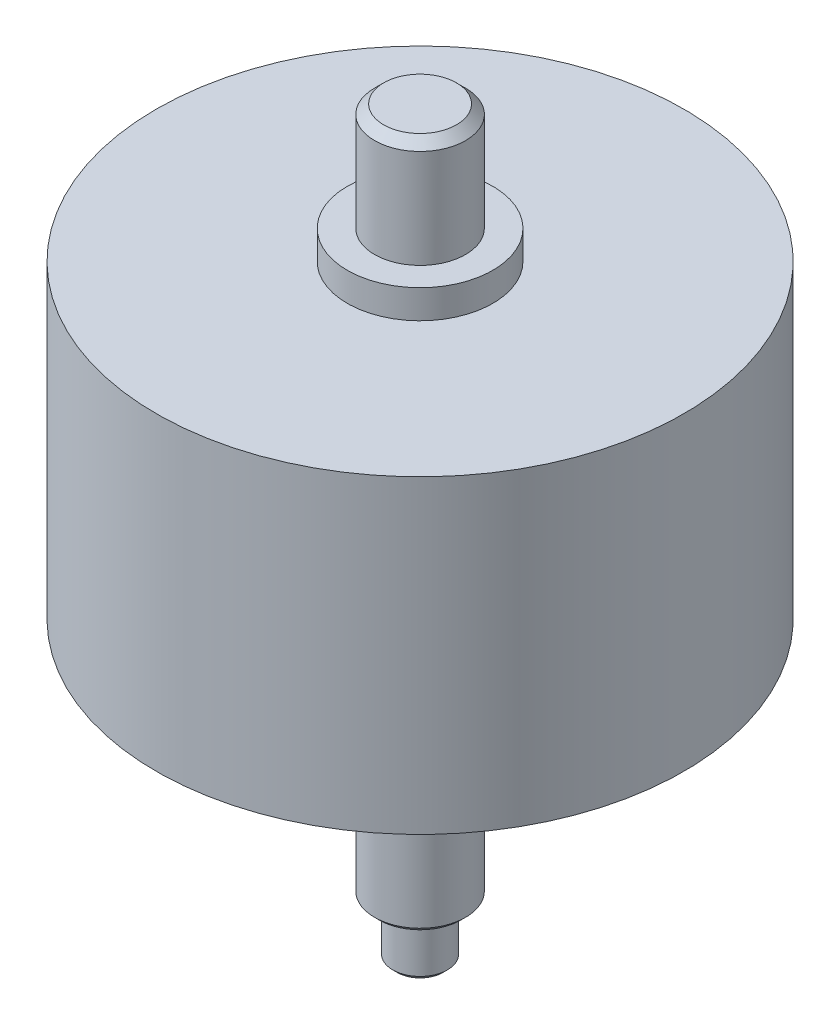
ISO-10303-21;
HEADER;
FILE_DESCRIPTION(('STEP AP214'),'2;1');
FILE_NAME('part.step','',(''),(''),'','','');
FILE_SCHEMA(('AUTOMOTIVE_DESIGN { 1 0 10303 214 1 1 1 1 }'));
ENDSEC;
DATA;
#1=APPLICATION_CONTEXT('core data for automotive mechanical design processes');
#2=APPLICATION_PROTOCOL_DEFINITION('international standard','automotive_design',2000,#1);
#3=PRODUCT_CONTEXT('',#1,'mechanical');
#4=PRODUCT('Part','Part','',(#3));
#5=PRODUCT_RELATED_PRODUCT_CATEGORY('part','',(#4));
#6=PRODUCT_DEFINITION_FORMATION('','',#4);
#7=PRODUCT_DEFINITION_CONTEXT('part definition',#1,'design');
#8=PRODUCT_DEFINITION('design','',#6,#7);
#9=PRODUCT_DEFINITION_SHAPE('','',#8);
#10=(LENGTH_UNIT() NAMED_UNIT(*) SI_UNIT(.MILLI.,.METRE.));
#11=(NAMED_UNIT(*) PLANE_ANGLE_UNIT() SI_UNIT($,.RADIAN.));
#12=(NAMED_UNIT(*) SI_UNIT($,.STERADIAN.) SOLID_ANGLE_UNIT());
#13=UNCERTAINTY_MEASURE_WITH_UNIT(LENGTH_MEASURE(1.E-05),#10,'distance_accuracy_value','');
#14=(GEOMETRIC_REPRESENTATION_CONTEXT(3) GLOBAL_UNCERTAINTY_ASSIGNED_CONTEXT((#13)) GLOBAL_UNIT_ASSIGNED_CONTEXT((#10,
#11,#12)) REPRESENTATION_CONTEXT('',''));
#15=CARTESIAN_POINT('',(0.,0.,0.));
#16=DIRECTION('',(0.,0.,1.));
#17=DIRECTION('',(1.,0.,0.));
#18=AXIS2_PLACEMENT_3D('',#15,#16,#17);
#19=CARTESIAN_POINT('',(-0.0228000000045833,-3.24966050013453,21.0660001071556));
#20=DIRECTION('',(0.,-1.,0.));
#21=DIRECTION('',(1.,0.,0.));
#22=AXIS2_PLACEMENT_3D('',#19,#20,#21);
#23=PLANE('',#22);
#24=CARTESIAN_POINT('',(-0.0228000000045833,-3.24966050004605,21.0660001071556));
#25=DIRECTION('',(0.,1.,0.));
#26=DIRECTION('',(-1.,0.,0.));
#27=AXIS2_PLACEMENT_3D('',#24,#25,#26);
#28=CIRCLE('',#27,1.25000000009016);
#29=CARTESIAN_POINT('',(-1.27280000009475,-3.24966050004608,21.0660001071556));
#30=VERTEX_POINT('',#29);
#31=EDGE_CURVE('E18',#30,#30,#28,.T.);
#32=ORIENTED_EDGE('',*,*,#31,.F.);
#33=EDGE_LOOP('',(#32));
#34=FACE_BOUND('',#33,.T.);
#35=ADVANCED_FACE('F15',(#34),#23,.T.);
#36=CARTESIAN_POINT('',(-0.0228000000045889,-2.99966049999508,21.0660001071556));
#37=DIRECTION('',(0.,1.,0.));
#38=DIRECTION('',(-1.,0.,0.));
#39=AXIS2_PLACEMENT_3D('',#36,#37,#38);
#40=CONICAL_SURFACE('',#39,1.50000000008428,0.785398163283739);
#41=CARTESIAN_POINT('',(-0.0228000000045889,-2.99966050013453,21.0660001071556));
#42=DIRECTION('',(0.,-1.,0.));
#43=DIRECTION('',(1.,0.,0.));
#44=AXIS2_PLACEMENT_3D('',#41,#42,#43);
#45=CIRCLE('',#44,1.5);
#46=CARTESIAN_POINT('',(1.47719999999541,-2.9996605001345,21.0660001071556));
#47=VERTEX_POINT('',#46);
#48=EDGE_CURVE('E59',#47,#47,#45,.F.);
#49=ORIENTED_EDGE('',*,*,#48,.F.);
#50=EDGE_LOOP('',(#49));
#51=FACE_BOUND('',#50,.T.);
#52=ORIENTED_EDGE('',*,*,#31,.T.);
#53=EDGE_LOOP('',(#52));
#54=FACE_BOUND('',#53,.T.);
#55=ADVANCED_FACE('F227',(#51,#54),#40,.T.);
#56=CARTESIAN_POINT('',(-0.0228000000046168,-1.74966050013453,21.0660001071556));
#57=DIRECTION('',(0.,-1.,0.));
#58=DIRECTION('',(1.,0.,0.));
#59=AXIS2_PLACEMENT_3D('',#56,#57,#58);
#60=CYLINDRICAL_SURFACE('',#59,1.5);
#61=CARTESIAN_POINT('',(-0.0228000000046503,-0.249660500134525,21.0660001071556));
#62=DIRECTION('',(0.,-1.,0.));
#63=DIRECTION('',(1.,0.,0.));
#64=AXIS2_PLACEMENT_3D('',#61,#62,#63);
#65=CIRCLE('',#64,1.5);
#66=CARTESIAN_POINT('',(1.47719999999535,-0.249660500134492,21.0660001071556));
#67=VERTEX_POINT('',#66);
#68=EDGE_CURVE('E57',#67,#67,#65,.T.);
#69=ORIENTED_EDGE('',*,*,#68,.T.);
#70=EDGE_LOOP('',(#69));
#71=FACE_BOUND('',#70,.T.);
#72=ORIENTED_EDGE('',*,*,#48,.T.);
#73=EDGE_LOOP('',(#72));
#74=FACE_BOUND('',#73,.T.);
#75=ADVANCED_FACE('F97',(#71,#74),#60,.T.);
#76=CARTESIAN_POINT('',(-0.0228000000054932,37.4753394998655,21.0660001071556));
#77=DIRECTION('',(0.,1.,0.));
#78=DIRECTION('',(-1.,0.,0.));
#79=AXIS2_PLACEMENT_3D('',#76,#77,#78);
#80=PLANE('',#79);
#81=CARTESIAN_POINT('',(-0.0228000000054931,37.4753394998493,21.0660001071556));
#82=DIRECTION('',(0.,-1.,0.));
#83=DIRECTION('',(1.,0.,0.));
#84=AXIS2_PLACEMENT_3D('',#81,#82,#83);
#85=CIRCLE('',#84,2.0000000000227);
#86=CARTESIAN_POINT('',(1.97720000001721,37.4753394998493,21.0660001071556));
#87=VERTEX_POINT('',#86);
#88=EDGE_CURVE('E55',#87,#87,#85,.T.);
#89=ORIENTED_EDGE('',*,*,#88,.F.);
#90=EDGE_LOOP('',(#89));
#91=FACE_BOUND('',#90,.T.);
#92=ADVANCED_FACE('F87',(#91),#80,.T.);
#93=CARTESIAN_POINT('',(-0.0228000000046503,-0.249660500134526,21.0660001071556));
#94=DIRECTION('',(0.,1.,0.));
#95=DIRECTION('',(-1.,0.,0.));
#96=AXIS2_PLACEMENT_3D('',#93,#94,#95);
#97=PLANE('',#96);
#98=ORIENTED_EDGE('',*,*,#68,.F.);
#99=EDGE_LOOP('',(#98));
#100=FACE_BOUND('',#99,.T.);
#101=CARTESIAN_POINT('',(-0.0228000000046503,-0.249660500130139,21.0660001071556));
#102=DIRECTION('',(0.,1.,0.));
#103=DIRECTION('',(-1.,0.,0.));
#104=AXIS2_PLACEMENT_3D('',#101,#102,#103);
#105=CIRCLE('',#104,2.25000000000364);
#106=CARTESIAN_POINT('',(-2.27280000000829,-0.249660500130189,21.0660001071556));
#107=VERTEX_POINT('',#106);
#108=EDGE_CURVE('E51',#107,#107,#105,.T.);
#109=ORIENTED_EDGE('',*,*,#108,.F.);
#110=EDGE_LOOP('',(#109));
#111=FACE_BOUND('',#110,.T.);
#112=ADVANCED_FACE('F85',(#100,#111),#97,.F.);
#113=CARTESIAN_POINT('',(-0.022800000005482,36.9753394999179,21.0660001071556));
#114=DIRECTION('',(0.,-1.,0.));
#115=DIRECTION('',(1.,0.,0.));
#116=AXIS2_PLACEMENT_3D('',#113,#114,#115);
#117=CONICAL_SURFACE('',#116,2.49999999989719,0.785398163340605);
#118=ORIENTED_EDGE('',*,*,#88,.T.);
#119=EDGE_LOOP('',(#118));
#120=FACE_BOUND('',#119,.T.);
#121=CARTESIAN_POINT('',(-0.022800000005482,36.9753394998655,21.0660001071556));
#122=DIRECTION('',(0.,1.,0.));
#123=DIRECTION('',(-1.,0.,0.));
#124=AXIS2_PLACEMENT_3D('',#121,#122,#123);
#125=CIRCLE('',#124,2.5);
#126=CARTESIAN_POINT('',(-2.52280000000548,36.9753394998654,21.0660001071556));
#127=VERTEX_POINT('',#126);
#128=EDGE_CURVE('E54',#127,#127,#125,.F.);
#129=ORIENTED_EDGE('',*,*,#128,.F.);
#130=EDGE_LOOP('',(#129));
#131=FACE_BOUND('',#130,.T.);
#132=ADVANCED_FACE('F81',(#120,#131),#117,.T.);
#133=CARTESIAN_POINT('',(-0.0228000000046559,0.000339499763411428,21.0660001071556));
#134=DIRECTION('',(0.,1.,0.));
#135=DIRECTION('',(-1.,0.,0.));
#136=AXIS2_PLACEMENT_3D('',#133,#134,#135);
#137=CONICAL_SURFACE('',#136,2.49999999989719,0.785398163397449);
#138=CARTESIAN_POINT('',(-0.0228000000046559,0.000339499865477377,21.0660001071557));
#139=DIRECTION('',(0.,1.,0.));
#140=DIRECTION('',(-1.,0.,0.));
#141=AXIS2_PLACEMENT_3D('',#138,#139,#140);
#142=CIRCLE('',#141,2.5);
#143=CARTESIAN_POINT('',(-2.52280000000466,0.000339499865421529,21.0660001071557));
#144=VERTEX_POINT('',#143);
#145=EDGE_CURVE('E50',#144,#144,#142,.T.);
#146=ORIENTED_EDGE('',*,*,#145,.F.);
#147=EDGE_LOOP('',(#146));
#148=FACE_BOUND('',#147,.T.);
#149=ORIENTED_EDGE('',*,*,#108,.T.);
#150=EDGE_LOOP('',(#149));
#151=FACE_BOUND('',#150,.T.);
#152=ADVANCED_FACE('F77',(#148,#151),#137,.T.);
#153=CARTESIAN_POINT('',(-0.0228000000054837,37.0503394998655,21.0660001071556));
#154=DIRECTION('',(0.,1.,0.));
#155=DIRECTION('',(-1.,0.,0.));
#156=AXIS2_PLACEMENT_3D('',#153,#154,#155);
#157=CYLINDRICAL_SURFACE('',#156,2.5);
#158=CARTESIAN_POINT('',(-0.0228000000053608,31.5503394998655,21.0660001071556));
#159=DIRECTION('',(0.,1.,0.));
#160=DIRECTION('',(-1.,0.,0.));
#161=AXIS2_PLACEMENT_3D('',#158,#159,#160);
#162=CIRCLE('',#161,2.5);
#163=CARTESIAN_POINT('',(-2.52280000000536,31.5503394998654,21.0660001071556));
#164=VERTEX_POINT('',#163);
#165=EDGE_CURVE('E47',#164,#164,#162,.F.);
#166=ORIENTED_EDGE('',*,*,#165,.F.);
#167=EDGE_LOOP('',(#166));
#168=FACE_BOUND('',#167,.T.);
#169=ORIENTED_EDGE('',*,*,#128,.T.);
#170=EDGE_LOOP('',(#169));
#171=FACE_BOUND('',#170,.T.);
#172=ADVANCED_FACE('F80',(#168,#171),#157,.T.);
#173=CARTESIAN_POINT('',(-0.0228000000042421,-18.5246605001345,21.0660001071557));
#174=DIRECTION('',(0.,1.,0.));
#175=DIRECTION('',(-1.,0.,0.));
#176=AXIS2_PLACEMENT_3D('',#173,#174,#175);
#177=CYLINDRICAL_SURFACE('',#176,2.5);
#178=ORIENTED_EDGE('',*,*,#145,.T.);
#179=EDGE_LOOP('',(#178));
#180=FACE_BOUND('',#179,.T.);
#181=CARTESIAN_POINT('',(-0.022800000004914,11.5503394998655,21.0660001071557));
#182=DIRECTION('',(0.,1.,0.));
#183=DIRECTION('',(-1.,0.,0.));
#184=AXIS2_PLACEMENT_3D('',#181,#182,#183);
#185=CIRCLE('',#184,2.5);
#186=CARTESIAN_POINT('',(-2.52280000000491,11.5503394998655,21.0660001071557));
#187=VERTEX_POINT('',#186);
#188=EDGE_CURVE('E44',#187,#187,#185,.F.);
#189=ORIENTED_EDGE('',*,*,#188,.T.);
#190=EDGE_LOOP('',(#189));
#191=FACE_BOUND('',#190,.T.);
#192=ADVANCED_FACE('F74',(#180,#191),#177,.T.);
#193=CARTESIAN_POINT('',(-0.0228000000053609,31.5503394998655,21.0660001071556));
#194=DIRECTION('',(0.,1.,0.));
#195=DIRECTION('',(-1.,0.,0.));
#196=AXIS2_PLACEMENT_3D('',#193,#194,#195);
#197=PLANE('',#196);
#198=ORIENTED_EDGE('',*,*,#165,.T.);
#199=EDGE_LOOP('',(#198));
#200=FACE_BOUND('',#199,.T.);
#201=CARTESIAN_POINT('',(-0.0228000000053608,31.5503394998655,21.0660001071556));
#202=DIRECTION('',(0.,1.,0.));
#203=DIRECTION('',(-1.,0.,0.));
#204=AXIS2_PLACEMENT_3D('',#201,#202,#203);
#205=CIRCLE('',#204,4.);
#206=CARTESIAN_POINT('',(-4.02280000000536,31.5503394998654,21.0660001071556));
#207=VERTEX_POINT('',#206);
#208=EDGE_CURVE('E41',#207,#207,#205,.F.);
#209=ORIENTED_EDGE('',*,*,#208,.F.);
#210=EDGE_LOOP('',(#209));
#211=FACE_BOUND('',#210,.T.);
#212=ADVANCED_FACE('F126',(#200,#211),#197,.T.);
#213=CARTESIAN_POINT('',(-0.022800000004914,11.5503394998655,21.0660001071556));
#214=DIRECTION('',(0.,1.,0.));
#215=DIRECTION('',(-1.,0.,0.));
#216=AXIS2_PLACEMENT_3D('',#213,#214,#215);
#217=PLANE('',#216);
#218=ORIENTED_EDGE('',*,*,#188,.F.);
#219=EDGE_LOOP('',(#218));
#220=FACE_BOUND('',#219,.T.);
#221=CARTESIAN_POINT('',(-0.022800000004914,11.5503394998655,21.0660001071556));
#222=DIRECTION('',(0.,1.,0.));
#223=DIRECTION('',(-1.,0.,0.));
#224=AXIS2_PLACEMENT_3D('',#221,#222,#223);
#225=CIRCLE('',#224,4.);
#226=CARTESIAN_POINT('',(-4.02280000000491,11.5503394998654,21.0660001071556));
#227=VERTEX_POINT('',#226);
#228=EDGE_CURVE('E38',#227,#227,#225,.T.);
#229=ORIENTED_EDGE('',*,*,#228,.F.);
#230=EDGE_LOOP('',(#229));
#231=FACE_BOUND('',#230,.T.);
#232=ADVANCED_FACE('F122',(#220,#231),#217,.F.);
#233=CARTESIAN_POINT('',(-0.0228000000054485,35.4753394998655,21.0660001071556));
#234=DIRECTION('',(0.,1.,0.));
#235=DIRECTION('',(-1.,0.,0.));
#236=AXIS2_PLACEMENT_3D('',#233,#234,#235);
#237=CYLINDRICAL_SURFACE('',#236,4.);
#238=CARTESIAN_POINT('',(-0.0228000000053256,29.9753394998655,21.0660001071556));
#239=DIRECTION('',(0.,1.,0.));
#240=DIRECTION('',(-1.,0.,0.));
#241=AXIS2_PLACEMENT_3D('',#238,#239,#240);
#242=CIRCLE('',#241,4.);
#243=CARTESIAN_POINT('',(-4.02280000000533,29.9753394998654,21.0660001071556));
#244=VERTEX_POINT('',#243);
#245=EDGE_CURVE('E35',#244,#244,#242,.F.);
#246=ORIENTED_EDGE('',*,*,#245,.F.);
#247=EDGE_LOOP('',(#246));
#248=FACE_BOUND('',#247,.T.);
#249=ORIENTED_EDGE('',*,*,#208,.T.);
#250=EDGE_LOOP('',(#249));
#251=FACE_BOUND('',#250,.T.);
#252=ADVANCED_FACE('F118',(#248,#251),#237,.T.);
#253=CARTESIAN_POINT('',(-0.022800000004914,11.5503394998655,21.0660001071556));
#254=DIRECTION('',(0.,1.,0.));
#255=DIRECTION('',(-1.,0.,0.));
#256=AXIS2_PLACEMENT_3D('',#253,#254,#255);
#257=CYLINDRICAL_SURFACE('',#256,4.);
#258=ORIENTED_EDGE('',*,*,#228,.T.);
#259=EDGE_LOOP('',(#258));
#260=FACE_BOUND('',#259,.T.);
#261=CARTESIAN_POINT('',(-0.0228000000049453,12.9503394998655,21.0660001071556));
#262=DIRECTION('',(0.,1.,0.));
#263=DIRECTION('',(-1.,0.,0.));
#264=AXIS2_PLACEMENT_3D('',#261,#262,#263);
#265=CIRCLE('',#264,4.);
#266=CARTESIAN_POINT('',(-4.02280000000495,12.9503394998654,21.0660001071556));
#267=VERTEX_POINT('',#266);
#268=EDGE_CURVE('E27',#267,#267,#265,.F.);
#269=ORIENTED_EDGE('',*,*,#268,.T.);
#270=EDGE_LOOP('',(#269));
#271=FACE_BOUND('',#270,.T.);
#272=ADVANCED_FACE('F114',(#260,#271),#257,.T.);
#273=CARTESIAN_POINT('',(-0.0228000000053257,29.9753394998655,21.0660001071556));
#274=DIRECTION('',(0.,1.,0.));
#275=DIRECTION('',(-1.,0.,0.));
#276=AXIS2_PLACEMENT_3D('',#273,#274,#275);
#277=PLANE('',#276);
#278=ORIENTED_EDGE('',*,*,#245,.T.);
#279=EDGE_LOOP('',(#278));
#280=FACE_BOUND('',#279,.T.);
#281=CARTESIAN_POINT('',(-0.0228000000053256,29.9753394998655,21.0660001071556));
#282=DIRECTION('',(0.,1.,0.));
#283=DIRECTION('',(-1.,0.,0.));
#284=AXIS2_PLACEMENT_3D('',#281,#282,#283);
#285=CIRCLE('',#284,14.5);
#286=CARTESIAN_POINT('',(-14.5228000000053,29.9753394998652,21.0660001071556));
#287=VERTEX_POINT('',#286);
#288=EDGE_CURVE('E22',#287,#287,#285,.F.);
#289=ORIENTED_EDGE('',*,*,#288,.F.);
#290=EDGE_LOOP('',(#289));
#291=FACE_BOUND('',#290,.T.);
#292=ADVANCED_FACE('F107',(#280,#291),#277,.T.);
#293=CARTESIAN_POINT('',(-0.0228000000049453,12.9503394998655,21.0660001071556));
#294=DIRECTION('',(0.,1.,0.));
#295=DIRECTION('',(-1.,0.,0.));
#296=AXIS2_PLACEMENT_3D('',#293,#294,#295);
#297=PLANE('',#296);
#298=ORIENTED_EDGE('',*,*,#268,.F.);
#299=EDGE_LOOP('',(#298));
#300=FACE_BOUND('',#299,.T.);
#301=CARTESIAN_POINT('',(-0.0228000000049453,12.9503394998655,21.0660001071556));
#302=DIRECTION('',(0.,1.,0.));
#303=DIRECTION('',(-1.,0.,0.));
#304=AXIS2_PLACEMENT_3D('',#301,#302,#303);
#305=CIRCLE('',#304,14.5);
#306=CARTESIAN_POINT('',(-14.5228000000049,12.9503394998652,21.0660001071556));
#307=VERTEX_POINT('',#306);
#308=EDGE_CURVE('E10',#307,#307,#305,.T.);
#309=ORIENTED_EDGE('',*,*,#308,.F.);
#310=EDGE_LOOP('',(#309));
#311=FACE_BOUND('',#310,.T.);
#312=ADVANCED_FACE('F102',(#300,#311),#297,.F.);
#313=CARTESIAN_POINT('',(-0.0228000000049453,12.9503394998655,21.0660001071556));
#314=DIRECTION('',(0.,1.,0.));
#315=DIRECTION('',(-1.,0.,0.));
#316=AXIS2_PLACEMENT_3D('',#313,#314,#315);
#317=CYLINDRICAL_SURFACE('',#316,14.5);
#318=ORIENTED_EDGE('',*,*,#308,.T.);
#319=EDGE_LOOP('',(#318));
#320=FACE_BOUND('',#319,.T.);
#321=ORIENTED_EDGE('',*,*,#288,.T.);
#322=EDGE_LOOP('',(#321));
#323=FACE_BOUND('',#322,.T.);
#324=ADVANCED_FACE('F100',(#320,#323),#317,.T.);
#325=CLOSED_SHELL('',(#35,#55,#75,#92,#112,#132,#152,#172,#192,#212,#232,#252,#272,#292,#312,#324));
#326=MANIFOLD_SOLID_BREP('B1',#325);
#327=ADVANCED_BREP_SHAPE_REPRESENTATION('',(#18,#326),#14);
#328=SHAPE_DEFINITION_REPRESENTATION(#9,#327);
ENDSEC;
END-ISO-10303-21;
